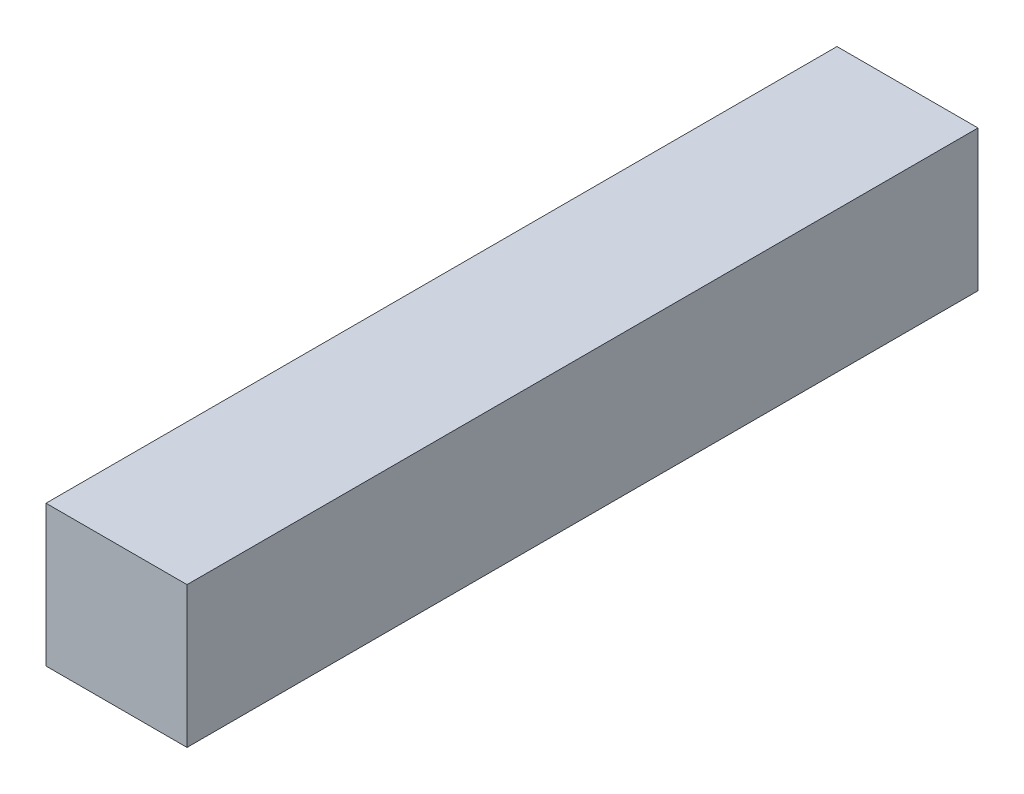
ISO-10303-21;
HEADER;
FILE_DESCRIPTION(('STEP AP214'),'2;1');
FILE_NAME('part.step','',(''),(''),'','','');
FILE_SCHEMA(('AUTOMOTIVE_DESIGN { 1 0 10303 214 1 1 1 1 }'));
ENDSEC;
DATA;
#1=APPLICATION_CONTEXT('core data for automotive mechanical design processes');
#2=APPLICATION_PROTOCOL_DEFINITION('international standard','automotive_design',2000,#1);
#3=PRODUCT_CONTEXT('',#1,'mechanical');
#4=PRODUCT('Part','Part','',(#3));
#5=PRODUCT_RELATED_PRODUCT_CATEGORY('part','',(#4));
#6=PRODUCT_DEFINITION_FORMATION('','',#4);
#7=PRODUCT_DEFINITION_CONTEXT('part definition',#1,'design');
#8=PRODUCT_DEFINITION('design','',#6,#7);
#9=PRODUCT_DEFINITION_SHAPE('','',#8);
#10=(LENGTH_UNIT() NAMED_UNIT(*) SI_UNIT(.MILLI.,.METRE.));
#11=(NAMED_UNIT(*) PLANE_ANGLE_UNIT() SI_UNIT($,.RADIAN.));
#12=(NAMED_UNIT(*) SI_UNIT($,.STERADIAN.) SOLID_ANGLE_UNIT());
#13=UNCERTAINTY_MEASURE_WITH_UNIT(LENGTH_MEASURE(1.E-05),#10,'distance_accuracy_value','');
#14=(GEOMETRIC_REPRESENTATION_CONTEXT(3) GLOBAL_UNCERTAINTY_ASSIGNED_CONTEXT((#13)) GLOBAL_UNIT_ASSIGNED_CONTEXT((#10,
#11,#12)) REPRESENTATION_CONTEXT('',''));
#15=CARTESIAN_POINT('',(0.,0.,0.));
#16=DIRECTION('',(0.,0.,1.));
#17=DIRECTION('',(1.,0.,0.));
#18=AXIS2_PLACEMENT_3D('',#15,#16,#17);
#19=CARTESIAN_POINT('',(3.9624,-3.9624,22.225));
#20=DIRECTION('',(-1.,0.,0.));
#21=DIRECTION('',(0.,0.,1.));
#22=AXIS2_PLACEMENT_3D('',#19,#20,#21);
#23=PLANE('',#22);
#24=DIRECTION('',(0.,1.,0.));
#25=VECTOR('',#24,1.);
#26=CARTESIAN_POINT('',(3.9624,-3.9624,-22.225));
#27=LINE('',#26,#25);
#28=CARTESIAN_POINT('',(3.9624,-3.9624,-22.225));
#29=VERTEX_POINT('',#28);
#30=CARTESIAN_POINT('',(3.9624,3.9624,-22.225));
#31=VERTEX_POINT('',#30);
#32=EDGE_CURVE('E95',#29,#31,#27,.T.);
#33=ORIENTED_EDGE('',*,*,#32,.T.);
#34=DIRECTION('',(0.,0.,-1.));
#35=VECTOR('',#34,1.);
#36=CARTESIAN_POINT('',(3.9624,3.9624,22.225));
#37=LINE('',#36,#35);
#38=CARTESIAN_POINT('',(3.9624,3.9624,22.225));
#39=VERTEX_POINT('',#38);
#40=EDGE_CURVE('E11',#39,#31,#37,.T.);
#41=ORIENTED_EDGE('',*,*,#40,.F.);
#42=DIRECTION('',(0.,1.,0.));
#43=VECTOR('',#42,1.);
#44=CARTESIAN_POINT('',(3.9624,-3.9624,22.225));
#45=LINE('',#44,#43);
#46=CARTESIAN_POINT('',(3.9624,-3.9624,22.225));
#47=VERTEX_POINT('',#46);
#48=EDGE_CURVE('E83',#47,#39,#45,.T.);
#49=ORIENTED_EDGE('',*,*,#48,.F.);
#50=DIRECTION('',(0.,0.,-1.));
#51=VECTOR('',#50,1.);
#52=CARTESIAN_POINT('',(3.9624,-3.9624,22.225));
#53=LINE('',#52,#51);
#54=EDGE_CURVE('E91',#47,#29,#53,.T.);
#55=ORIENTED_EDGE('',*,*,#54,.T.);
#56=EDGE_LOOP('',(#33,#41,#49,#55));
#57=FACE_BOUND('',#56,.T.);
#58=ADVANCED_FACE('F32',(#57),#23,.F.);
#59=CARTESIAN_POINT('',(-3.9624,3.9624,22.225));
#60=DIRECTION('',(0.,-1.,0.));
#61=DIRECTION('',(0.,0.,-1.));
#62=AXIS2_PLACEMENT_3D('',#59,#60,#61);
#63=PLANE('',#62);
#64=DIRECTION('',(-1.,0.,0.));
#65=VECTOR('',#64,1.);
#66=CARTESIAN_POINT('',(-3.9624,3.9624,-22.225));
#67=LINE('',#66,#65);
#68=CARTESIAN_POINT('',(-3.9624,3.9624,-22.225));
#69=VERTEX_POINT('',#68);
#70=EDGE_CURVE('E87',#31,#69,#67,.T.);
#71=ORIENTED_EDGE('',*,*,#70,.T.);
#72=DIRECTION('',(0.,0.,-1.));
#73=VECTOR('',#72,1.);
#74=CARTESIAN_POINT('',(-3.9624,3.9624,22.225));
#75=LINE('',#74,#73);
#76=CARTESIAN_POINT('',(-3.9624,3.9624,22.225));
#77=VERTEX_POINT('',#76);
#78=EDGE_CURVE('E40',#77,#69,#75,.T.);
#79=ORIENTED_EDGE('',*,*,#78,.F.);
#80=DIRECTION('',(-1.,0.,0.));
#81=VECTOR('',#80,1.);
#82=CARTESIAN_POINT('',(-3.9624,3.9624,22.225));
#83=LINE('',#82,#81);
#84=EDGE_CURVE('E78',#39,#77,#83,.T.);
#85=ORIENTED_EDGE('',*,*,#84,.F.);
#86=ORIENTED_EDGE('',*,*,#40,.T.);
#87=EDGE_LOOP('',(#71,#79,#85,#86));
#88=FACE_BOUND('',#87,.T.);
#89=ADVANCED_FACE('F86',(#88),#63,.F.);
#90=CARTESIAN_POINT('',(-3.9624,-3.9624,22.225));
#91=DIRECTION('',(1.,0.,0.));
#92=DIRECTION('',(0.,0.,-1.));
#93=AXIS2_PLACEMENT_3D('',#90,#91,#92);
#94=PLANE('',#93);
#95=DIRECTION('',(0.,-1.,0.));
#96=VECTOR('',#95,1.);
#97=CARTESIAN_POINT('',(-3.9624,-3.9624,-22.225));
#98=LINE('',#97,#96);
#99=CARTESIAN_POINT('',(-3.9624,-3.9624,-22.225));
#100=VERTEX_POINT('',#99);
#101=EDGE_CURVE('E65',#69,#100,#98,.T.);
#102=ORIENTED_EDGE('',*,*,#101,.T.);
#103=DIRECTION('',(0.,0.,-1.));
#104=VECTOR('',#103,1.);
#105=CARTESIAN_POINT('',(-3.9624,-3.9624,22.225));
#106=LINE('',#105,#104);
#107=CARTESIAN_POINT('',(-3.9624,-3.9624,22.225));
#108=VERTEX_POINT('',#107);
#109=EDGE_CURVE('E88',#108,#100,#106,.T.);
#110=ORIENTED_EDGE('',*,*,#109,.F.);
#111=DIRECTION('',(0.,-1.,0.));
#112=VECTOR('',#111,1.);
#113=CARTESIAN_POINT('',(-3.9624,-3.9624,22.225));
#114=LINE('',#113,#112);
#115=EDGE_CURVE('E81',#77,#108,#114,.T.);
#116=ORIENTED_EDGE('',*,*,#115,.F.);
#117=ORIENTED_EDGE('',*,*,#78,.T.);
#118=EDGE_LOOP('',(#102,#110,#116,#117));
#119=FACE_BOUND('',#118,.T.);
#120=ADVANCED_FACE('F89',(#119),#94,.F.);
#121=CARTESIAN_POINT('',(-3.9624,-3.9624,22.225));
#122=DIRECTION('',(0.,1.,0.));
#123=DIRECTION('',(0.,0.,1.));
#124=AXIS2_PLACEMENT_3D('',#121,#122,#123);
#125=PLANE('',#124);
#126=DIRECTION('',(1.,0.,0.));
#127=VECTOR('',#126,1.);
#128=CARTESIAN_POINT('',(-3.9624,-3.9624,-22.225));
#129=LINE('',#128,#127);
#130=EDGE_CURVE('E71',#100,#29,#129,.T.);
#131=ORIENTED_EDGE('',*,*,#130,.T.);
#132=ORIENTED_EDGE('',*,*,#54,.F.);
#133=DIRECTION('',(1.,0.,0.));
#134=VECTOR('',#133,1.);
#135=CARTESIAN_POINT('',(-3.9624,-3.9624,22.225));
#136=LINE('',#135,#134);
#137=EDGE_CURVE('E48',#108,#47,#136,.T.);
#138=ORIENTED_EDGE('',*,*,#137,.F.);
#139=ORIENTED_EDGE('',*,*,#109,.T.);
#140=EDGE_LOOP('',(#131,#132,#138,#139));
#141=FACE_BOUND('',#140,.T.);
#142=ADVANCED_FACE('F102',(#141),#125,.F.);
#143=CARTESIAN_POINT('',(0.,0.,22.225));
#144=DIRECTION('',(0.,0.,-1.));
#145=DIRECTION('',(-1.,0.,0.));
#146=AXIS2_PLACEMENT_3D('',#143,#144,#145);
#147=PLANE('',#146);
#148=ORIENTED_EDGE('',*,*,#48,.T.);
#149=ORIENTED_EDGE('',*,*,#84,.T.);
#150=ORIENTED_EDGE('',*,*,#115,.T.);
#151=ORIENTED_EDGE('',*,*,#137,.T.);
#152=EDGE_LOOP('',(#148,#149,#150,#151));
#153=FACE_BOUND('',#152,.T.);
#154=ADVANCED_FACE('F79',(#153),#147,.F.);
#155=CARTESIAN_POINT('',(0.,0.,-22.225));
#156=DIRECTION('',(0.,0.,-1.));
#157=DIRECTION('',(-1.,0.,0.));
#158=AXIS2_PLACEMENT_3D('',#155,#156,#157);
#159=PLANE('',#158);
#160=ORIENTED_EDGE('',*,*,#32,.F.);
#161=ORIENTED_EDGE('',*,*,#130,.F.);
#162=ORIENTED_EDGE('',*,*,#101,.F.);
#163=ORIENTED_EDGE('',*,*,#70,.F.);
#164=EDGE_LOOP('',(#160,#161,#162,#163));
#165=FACE_BOUND('',#164,.T.);
#166=ADVANCED_FACE('F105',(#165),#159,.T.);
#167=CLOSED_SHELL('',(#58,#89,#120,#142,#154,#166));
#168=MANIFOLD_SOLID_BREP('B2',#167);
#169=ADVANCED_BREP_SHAPE_REPRESENTATION('',(#18,#168),#14);
#170=SHAPE_DEFINITION_REPRESENTATION(#9,#169);
ENDSEC;
END-ISO-10303-21;
